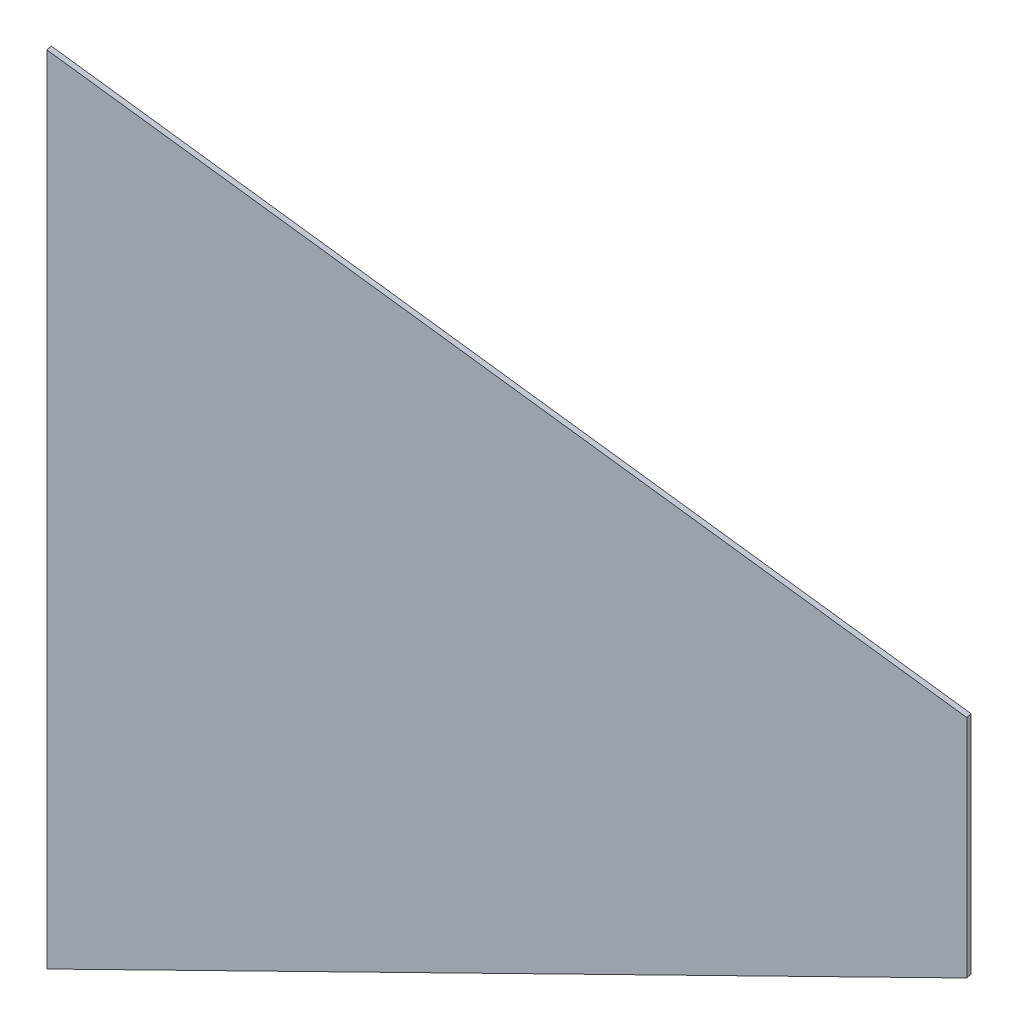
ISO-10303-21;
HEADER;
FILE_DESCRIPTION(('STEP AP214'),'2;1');
FILE_NAME('part.step','',(''),(''),'','','');
FILE_SCHEMA(('AUTOMOTIVE_DESIGN { 1 0 10303 214 1 1 1 1 }'));
ENDSEC;
DATA;
#1=APPLICATION_CONTEXT('core data for automotive mechanical design processes');
#2=APPLICATION_PROTOCOL_DEFINITION('international standard','automotive_design',2000,#1);
#3=PRODUCT_CONTEXT('',#1,'mechanical');
#4=PRODUCT('Part','Part','',(#3));
#5=PRODUCT_RELATED_PRODUCT_CATEGORY('part','',(#4));
#6=PRODUCT_DEFINITION_FORMATION('','',#4);
#7=PRODUCT_DEFINITION_CONTEXT('part definition',#1,'design');
#8=PRODUCT_DEFINITION('design','',#6,#7);
#9=PRODUCT_DEFINITION_SHAPE('','',#8);
#10=(LENGTH_UNIT() NAMED_UNIT(*) SI_UNIT(.MILLI.,.METRE.));
#11=(NAMED_UNIT(*) PLANE_ANGLE_UNIT() SI_UNIT($,.RADIAN.));
#12=(NAMED_UNIT(*) SI_UNIT($,.STERADIAN.) SOLID_ANGLE_UNIT());
#13=UNCERTAINTY_MEASURE_WITH_UNIT(LENGTH_MEASURE(1.E-05),#10,'distance_accuracy_value','');
#14=(GEOMETRIC_REPRESENTATION_CONTEXT(3) GLOBAL_UNCERTAINTY_ASSIGNED_CONTEXT((#13)) GLOBAL_UNIT_ASSIGNED_CONTEXT((#10,
#11,#12)) REPRESENTATION_CONTEXT('',''));
#15=CARTESIAN_POINT('',(0.,0.,0.));
#16=DIRECTION('',(0.,0.,1.));
#17=DIRECTION('',(1.,0.,0.));
#18=AXIS2_PLACEMENT_3D('',#15,#16,#17);
#19=CARTESIAN_POINT('',(-362.838527195446,224.098656225901,839.187277422507));
#20=DIRECTION('',(-0.976296007119933,0.,0.216439613938103));
#21=DIRECTION('',(0.216439613938103,0.,0.976296007119933));
#22=AXIS2_PLACEMENT_3D('',#19,#20,#21);
#23=PLANE('',#22);
#24=DIRECTION('',(0.,-1.,0.));
#25=VECTOR('',#24,1.);
#26=CARTESIAN_POINT('',(-362.151331421192,224.098656225901,842.287017245112));
#27=LINE('',#26,#25);
#28=CARTESIAN_POINT('',(-362.151331421192,224.098656225901,842.287017245112));
#29=VERTEX_POINT('',#28);
#30=CARTESIAN_POINT('',(-362.151331421192,-224.098656225901,842.287017245112));
#31=VERTEX_POINT('',#30);
#32=EDGE_CURVE('E85',#29,#31,#27,.T.);
#33=ORIENTED_EDGE('',*,*,#32,.F.);
#34=DIRECTION('',(0.216439613938103,0.,0.976296007119933));
#35=VECTOR('',#34,1.);
#36=CARTESIAN_POINT('',(-362.838527195446,224.098656225901,839.187277422507));
#37=LINE('',#36,#35);
#38=CARTESIAN_POINT('',(-362.838527195446,224.098656225901,839.187277422507));
#39=VERTEX_POINT('',#38);
#40=EDGE_CURVE('E53',#39,#29,#37,.T.);
#41=ORIENTED_EDGE('',*,*,#40,.F.);
#42=DIRECTION('',(0.,-1.,0.));
#43=VECTOR('',#42,1.);
#44=CARTESIAN_POINT('',(-362.838527195446,224.098656225901,839.187277422507));
#45=LINE('',#44,#43);
#46=CARTESIAN_POINT('',(-362.838527195446,-224.098656225901,839.187277422507));
#47=VERTEX_POINT('',#46);
#48=EDGE_CURVE('E87',#39,#47,#45,.T.);
#49=ORIENTED_EDGE('',*,*,#48,.T.);
#50=DIRECTION('',(0.216439613938103,0.,0.976296007119933));
#51=VECTOR('',#50,1.);
#52=CARTESIAN_POINT('',(-362.838527195446,-224.098656225901,839.187277422507));
#53=LINE('',#52,#51);
#54=EDGE_CURVE('E95',#47,#31,#53,.T.);
#55=ORIENTED_EDGE('',*,*,#54,.T.);
#56=EDGE_LOOP('',(#33,#41,#49,#55));
#57=FACE_BOUND('',#56,.T.);
#58=ADVANCED_FACE('F45',(#57),#23,.T.);
#59=CARTESIAN_POINT('',(160.330361948953,25.92705,723.203527038358));
#60=DIRECTION('',(0.338631983902186,0.937919206887706,-0.0750729034313046));
#61=DIRECTION('',(-0.940573460159209,0.339590291445637,0.));
#62=AXIS2_PLACEMENT_3D('',#59,#60,#61);
#63=PLANE('',#62);
#64=DIRECTION('',(0.216439613938103,0.,0.976296007119933));
#65=VECTOR('',#64,1.);
#66=CARTESIAN_POINT('',(36.6302621368097,63.4999520451678,634.643428550959));
#67=LINE('',#66,#65);
#68=CARTESIAN_POINT('',(61.1386876255679,63.4999520451678,745.193791814469));
#69=VERTEX_POINT('',#68);
#70=CARTESIAN_POINT('',(61.8258833998213,63.4999520451678,748.293531637074));
#71=VERTEX_POINT('',#70);
#72=EDGE_CURVE('E59',#69,#71,#67,.T.);
#73=ORIENTED_EDGE('',*,*,#72,.F.);
#74=DIRECTION('',(-0.915686776685562,0.34685380400269,0.203002871043907));
#75=VECTOR('',#74,1.);
#76=CARTESIAN_POINT('',(160.330361948953,25.92705,723.203527038358));
#77=LINE('',#76,#75);
#78=EDGE_CURVE('E67',#69,#39,#77,.T.);
#79=ORIENTED_EDGE('',*,*,#78,.T.);
#80=ORIENTED_EDGE('',*,*,#40,.T.);
#81=DIRECTION('',(-0.915686776685562,0.34685380400269,0.203002871043907));
#82=VECTOR('',#81,1.);
#83=CARTESIAN_POINT('',(161.017557723207,25.92705,726.303266860963));
#84=LINE('',#83,#82);
#85=EDGE_CURVE('E81',#71,#29,#84,.T.);
#86=ORIENTED_EDGE('',*,*,#85,.F.);
#87=EDGE_LOOP('',(#73,#79,#80,#86));
#88=FACE_BOUND('',#87,.T.);
#89=ADVANCED_FACE('F90',(#88),#63,.T.);
#90=CARTESIAN_POINT('',(-362.838527195446,-224.098656225901,839.187277422507));
#91=DIRECTION('',(0.338631983902185,-0.937919206887706,-0.0750729034313045));
#92=DIRECTION('',(0.94057346015921,0.339590291445636,0.));
#93=AXIS2_PLACEMENT_3D('',#90,#91,#92);
#94=PLANE('',#93);
#95=DIRECTION('',(0.216439613938103,0.,0.976296007119933));
#96=VECTOR('',#95,1.);
#97=CARTESIAN_POINT('',(36.6302621368098,-63.4999520451677,634.643428550959));
#98=LINE('',#97,#96);
#99=CARTESIAN_POINT('',(61.1386876255679,-63.4999520451677,745.193791814469));
#100=VERTEX_POINT('',#99);
#101=CARTESIAN_POINT('',(61.8258833998214,-63.4999520451677,748.293531637074));
#102=VERTEX_POINT('',#101);
#103=EDGE_CURVE('E120',#100,#102,#98,.T.);
#104=ORIENTED_EDGE('',*,*,#103,.T.);
#105=DIRECTION('',(0.915686776685562,0.346853804002689,-0.203002871043907));
#106=VECTOR('',#105,1.);
#107=CARTESIAN_POINT('',(-362.151331421192,-224.098656225901,842.287017245112));
#108=LINE('',#107,#106);
#109=EDGE_CURVE('E88',#31,#102,#108,.T.);
#110=ORIENTED_EDGE('',*,*,#109,.F.);
#111=ORIENTED_EDGE('',*,*,#54,.F.);
#112=DIRECTION('',(0.915686776685562,0.346853804002689,-0.203002871043907));
#113=VECTOR('',#112,1.);
#114=CARTESIAN_POINT('',(-362.838527195446,-224.098656225901,839.187277422507));
#115=LINE('',#114,#113);
#116=EDGE_CURVE('E110',#47,#100,#115,.T.);
#117=ORIENTED_EDGE('',*,*,#116,.T.);
#118=EDGE_LOOP('',(#104,#110,#111,#117));
#119=FACE_BOUND('',#118,.T.);
#120=ADVANCED_FACE('F126',(#119),#94,.T.);
#121=CARTESIAN_POINT('',(160.330361948953,0.,723.203527038357));
#122=DIRECTION('',(0.216439613938103,0.,0.976296007119933));
#123=DIRECTION('',(0.976296007119933,0.,-0.216439613938103));
#124=AXIS2_PLACEMENT_3D('',#121,#122,#123);
#125=PLANE('',#124);
#126=ORIENTED_EDGE('',*,*,#78,.F.);
#127=DIRECTION('',(0.,-1.,0.));
#128=VECTOR('',#127,1.);
#129=CARTESIAN_POINT('',(61.1386876255679,0.,745.193791814469));
#130=LINE('',#129,#128);
#131=EDGE_CURVE('E99',#69,#100,#130,.T.);
#132=ORIENTED_EDGE('',*,*,#131,.T.);
#133=ORIENTED_EDGE('',*,*,#116,.F.);
#134=ORIENTED_EDGE('',*,*,#48,.F.);
#135=EDGE_LOOP('',(#126,#132,#133,#134));
#136=FACE_BOUND('',#135,.T.);
#137=ADVANCED_FACE('F131',(#136),#125,.F.);
#138=CARTESIAN_POINT('',(161.017557723206,0.,726.303266860963));
#139=DIRECTION('',(0.216439613938103,0.,0.976296007119933));
#140=DIRECTION('',(0.976296007119933,0.,-0.216439613938103));
#141=AXIS2_PLACEMENT_3D('',#138,#139,#140);
#142=PLANE('',#141);
#143=DIRECTION('',(0.,-1.,0.));
#144=VECTOR('',#143,1.);
#145=CARTESIAN_POINT('',(61.8258833998214,0.,748.293531637074));
#146=LINE('',#145,#144);
#147=EDGE_CURVE('E11',#71,#102,#146,.T.);
#148=ORIENTED_EDGE('',*,*,#147,.F.);
#149=ORIENTED_EDGE('',*,*,#85,.T.);
#150=ORIENTED_EDGE('',*,*,#32,.T.);
#151=ORIENTED_EDGE('',*,*,#109,.T.);
#152=EDGE_LOOP('',(#148,#149,#150,#151));
#153=FACE_BOUND('',#152,.T.);
#154=ADVANCED_FACE('F82',(#153),#142,.T.);
#155=CARTESIAN_POINT('',(36.6302621368098,-63.4999520451677,634.643428550959));
#156=DIRECTION('',(-0.976296007119933,0.,0.216439613938103));
#157=DIRECTION('',(0.216439613938103,0.,0.976296007119933));
#158=AXIS2_PLACEMENT_3D('',#155,#156,#157);
#159=PLANE('',#158);
#160=ORIENTED_EDGE('',*,*,#72,.T.);
#161=ORIENTED_EDGE('',*,*,#147,.T.);
#162=ORIENTED_EDGE('',*,*,#103,.F.);
#163=ORIENTED_EDGE('',*,*,#131,.F.);
#164=EDGE_LOOP('',(#160,#161,#162,#163));
#165=FACE_BOUND('',#164,.T.);
#166=ADVANCED_FACE('F128',(#165),#159,.F.);
#167=CLOSED_SHELL('',(#58,#89,#120,#137,#154,#166));
#168=MANIFOLD_SOLID_BREP('B2',#167);
#169=ADVANCED_BREP_SHAPE_REPRESENTATION('',(#18,#168),#14);
#170=SHAPE_DEFINITION_REPRESENTATION(#9,#169);
ENDSEC;
END-ISO-10303-21;
